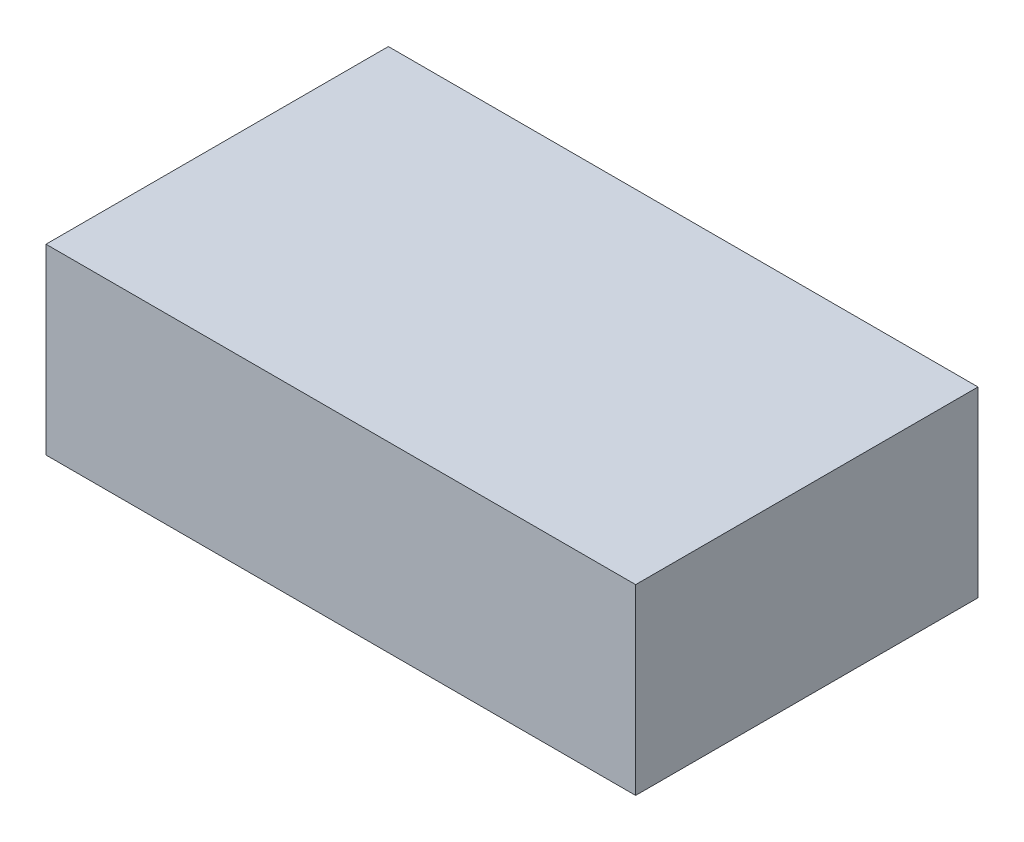
ISO-10303-21;
HEADER;
FILE_DESCRIPTION(('STEP AP214'),'2;1');
FILE_NAME('part.step','',(''),(''),'','','');
FILE_SCHEMA(('AUTOMOTIVE_DESIGN { 1 0 10303 214 1 1 1 1 }'));
ENDSEC;
DATA;
#1=APPLICATION_CONTEXT('core data for automotive mechanical design processes');
#2=APPLICATION_PROTOCOL_DEFINITION('international standard','automotive_design',2000,#1);
#3=PRODUCT_CONTEXT('',#1,'mechanical');
#4=PRODUCT('Part','Part','',(#3));
#5=PRODUCT_RELATED_PRODUCT_CATEGORY('part','',(#4));
#6=PRODUCT_DEFINITION_FORMATION('','',#4);
#7=PRODUCT_DEFINITION_CONTEXT('part definition',#1,'design');
#8=PRODUCT_DEFINITION('design','',#6,#7);
#9=PRODUCT_DEFINITION_SHAPE('','',#8);
#10=(LENGTH_UNIT() NAMED_UNIT(*) SI_UNIT(.MILLI.,.METRE.));
#11=(NAMED_UNIT(*) PLANE_ANGLE_UNIT() SI_UNIT($,.RADIAN.));
#12=(NAMED_UNIT(*) SI_UNIT($,.STERADIAN.) SOLID_ANGLE_UNIT());
#13=UNCERTAINTY_MEASURE_WITH_UNIT(LENGTH_MEASURE(1.E-05),#10,'distance_accuracy_value','');
#14=(GEOMETRIC_REPRESENTATION_CONTEXT(3) GLOBAL_UNCERTAINTY_ASSIGNED_CONTEXT((#13)) GLOBAL_UNIT_ASSIGNED_CONTEXT((#10,
#11,#12)) REPRESENTATION_CONTEXT('',''));
#15=CARTESIAN_POINT('',(0.,0.,0.));
#16=DIRECTION('',(0.,0.,1.));
#17=DIRECTION('',(1.,0.,0.));
#18=AXIS2_PLACEMENT_3D('',#15,#16,#17);
#19=CARTESIAN_POINT('',(0.,14.4,0.));
#20=DIRECTION('',(1.,0.,0.));
#21=DIRECTION('',(0.,0.,-1.));
#22=AXIS2_PLACEMENT_3D('',#19,#20,#21);
#23=PLANE('',#22);
#24=DIRECTION('',(0.,0.,1.));
#25=VECTOR('',#24,1.);
#26=CARTESIAN_POINT('',(0.,0.,0.));
#27=LINE('',#26,#25);
#28=CARTESIAN_POINT('',(0.,0.,-27.));
#29=VERTEX_POINT('',#28);
#30=CARTESIAN_POINT('',(0.,0.,0.));
#31=VERTEX_POINT('',#30);
#32=EDGE_CURVE('E100',#29,#31,#27,.T.);
#33=ORIENTED_EDGE('',*,*,#32,.T.);
#34=DIRECTION('',(0.,-1.,0.));
#35=VECTOR('',#34,1.);
#36=CARTESIAN_POINT('',(0.,14.4,0.));
#37=LINE('',#36,#35);
#38=CARTESIAN_POINT('',(0.,14.4,0.));
#39=VERTEX_POINT('',#38);
#40=EDGE_CURVE('E11',#39,#31,#37,.T.);
#41=ORIENTED_EDGE('',*,*,#40,.F.);
#42=DIRECTION('',(0.,0.,1.));
#43=VECTOR('',#42,1.);
#44=CARTESIAN_POINT('',(0.,14.4,0.));
#45=LINE('',#44,#43);
#46=CARTESIAN_POINT('',(0.,14.4,-27.));
#47=VERTEX_POINT('',#46);
#48=EDGE_CURVE('E88',#47,#39,#45,.T.);
#49=ORIENTED_EDGE('',*,*,#48,.F.);
#50=DIRECTION('',(0.,-1.,0.));
#51=VECTOR('',#50,1.);
#52=CARTESIAN_POINT('',(0.,14.4,-27.));
#53=LINE('',#52,#51);
#54=EDGE_CURVE('E96',#47,#29,#53,.T.);
#55=ORIENTED_EDGE('',*,*,#54,.T.);
#56=EDGE_LOOP('',(#33,#41,#49,#55));
#57=FACE_BOUND('',#56,.T.);
#58=ADVANCED_FACE('F37',(#57),#23,.F.);
#59=CARTESIAN_POINT('',(0.,14.4,0.));
#60=DIRECTION('',(0.,0.,-1.));
#61=DIRECTION('',(-1.,0.,0.));
#62=AXIS2_PLACEMENT_3D('',#59,#60,#61);
#63=PLANE('',#62);
#64=DIRECTION('',(1.,0.,0.));
#65=VECTOR('',#64,1.);
#66=CARTESIAN_POINT('',(0.,0.,0.));
#67=LINE('',#66,#65);
#68=CARTESIAN_POINT('',(46.5,0.,0.));
#69=VERTEX_POINT('',#68);
#70=EDGE_CURVE('E92',#31,#69,#67,.T.);
#71=ORIENTED_EDGE('',*,*,#70,.T.);
#72=DIRECTION('',(0.,-1.,0.));
#73=VECTOR('',#72,1.);
#74=CARTESIAN_POINT('',(46.5,14.4,0.));
#75=LINE('',#74,#73);
#76=CARTESIAN_POINT('',(46.5,14.4,0.));
#77=VERTEX_POINT('',#76);
#78=EDGE_CURVE('E45',#77,#69,#75,.T.);
#79=ORIENTED_EDGE('',*,*,#78,.F.);
#80=DIRECTION('',(1.,0.,0.));
#81=VECTOR('',#80,1.);
#82=CARTESIAN_POINT('',(0.,14.4,0.));
#83=LINE('',#82,#81);
#84=EDGE_CURVE('E83',#39,#77,#83,.T.);
#85=ORIENTED_EDGE('',*,*,#84,.F.);
#86=ORIENTED_EDGE('',*,*,#40,.T.);
#87=EDGE_LOOP('',(#71,#79,#85,#86));
#88=FACE_BOUND('',#87,.T.);
#89=ADVANCED_FACE('F91',(#88),#63,.F.);
#90=CARTESIAN_POINT('',(46.5,14.4,0.));
#91=DIRECTION('',(-1.,0.,0.));
#92=DIRECTION('',(0.,0.,1.));
#93=AXIS2_PLACEMENT_3D('',#90,#91,#92);
#94=PLANE('',#93);
#95=DIRECTION('',(0.,0.,-1.));
#96=VECTOR('',#95,1.);
#97=CARTESIAN_POINT('',(46.5,0.,0.));
#98=LINE('',#97,#96);
#99=CARTESIAN_POINT('',(46.5,0.,-27.));
#100=VERTEX_POINT('',#99);
#101=EDGE_CURVE('E70',#69,#100,#98,.T.);
#102=ORIENTED_EDGE('',*,*,#101,.T.);
#103=DIRECTION('',(0.,-1.,0.));
#104=VECTOR('',#103,1.);
#105=CARTESIAN_POINT('',(46.5,14.4,-27.));
#106=LINE('',#105,#104);
#107=CARTESIAN_POINT('',(46.5,14.4,-27.));
#108=VERTEX_POINT('',#107);
#109=EDGE_CURVE('E93',#108,#100,#106,.T.);
#110=ORIENTED_EDGE('',*,*,#109,.F.);
#111=DIRECTION('',(0.,0.,-1.));
#112=VECTOR('',#111,1.);
#113=CARTESIAN_POINT('',(46.5,14.4,0.));
#114=LINE('',#113,#112);
#115=EDGE_CURVE('E86',#77,#108,#114,.T.);
#116=ORIENTED_EDGE('',*,*,#115,.F.);
#117=ORIENTED_EDGE('',*,*,#78,.T.);
#118=EDGE_LOOP('',(#102,#110,#116,#117));
#119=FACE_BOUND('',#118,.T.);
#120=ADVANCED_FACE('F94',(#119),#94,.F.);
#121=CARTESIAN_POINT('',(0.,14.4,-27.));
#122=DIRECTION('',(0.,0.,1.));
#123=DIRECTION('',(1.,0.,0.));
#124=AXIS2_PLACEMENT_3D('',#121,#122,#123);
#125=PLANE('',#124);
#126=DIRECTION('',(-1.,0.,0.));
#127=VECTOR('',#126,1.);
#128=CARTESIAN_POINT('',(0.,0.,-27.));
#129=LINE('',#128,#127);
#130=EDGE_CURVE('E76',#100,#29,#129,.T.);
#131=ORIENTED_EDGE('',*,*,#130,.T.);
#132=ORIENTED_EDGE('',*,*,#54,.F.);
#133=DIRECTION('',(-1.,0.,0.));
#134=VECTOR('',#133,1.);
#135=CARTESIAN_POINT('',(0.,14.4,-27.));
#136=LINE('',#135,#134);
#137=EDGE_CURVE('E53',#108,#47,#136,.T.);
#138=ORIENTED_EDGE('',*,*,#137,.F.);
#139=ORIENTED_EDGE('',*,*,#109,.T.);
#140=EDGE_LOOP('',(#131,#132,#138,#139));
#141=FACE_BOUND('',#140,.T.);
#142=ADVANCED_FACE('F107',(#141),#125,.F.);
#143=CARTESIAN_POINT('',(0.,14.4,0.));
#144=DIRECTION('',(0.,-1.,0.));
#145=DIRECTION('',(0.,0.,-1.));
#146=AXIS2_PLACEMENT_3D('',#143,#144,#145);
#147=PLANE('',#146);
#148=ORIENTED_EDGE('',*,*,#48,.T.);
#149=ORIENTED_EDGE('',*,*,#84,.T.);
#150=ORIENTED_EDGE('',*,*,#115,.T.);
#151=ORIENTED_EDGE('',*,*,#137,.T.);
#152=EDGE_LOOP('',(#148,#149,#150,#151));
#153=FACE_BOUND('',#152,.T.);
#154=ADVANCED_FACE('F84',(#153),#147,.F.);
#155=CARTESIAN_POINT('',(0.,0.,0.));
#156=DIRECTION('',(0.,-1.,0.));
#157=DIRECTION('',(0.,0.,-1.));
#158=AXIS2_PLACEMENT_3D('',#155,#156,#157);
#159=PLANE('',#158);
#160=ORIENTED_EDGE('',*,*,#32,.F.);
#161=ORIENTED_EDGE('',*,*,#130,.F.);
#162=ORIENTED_EDGE('',*,*,#101,.F.);
#163=ORIENTED_EDGE('',*,*,#70,.F.);
#164=EDGE_LOOP('',(#160,#161,#162,#163));
#165=FACE_BOUND('',#164,.T.);
#166=ADVANCED_FACE('F110',(#165),#159,.T.);
#167=CLOSED_SHELL('',(#58,#89,#120,#142,#154,#166));
#168=MANIFOLD_SOLID_BREP('B2',#167);
#169=ADVANCED_BREP_SHAPE_REPRESENTATION('',(#18,#168),#14);
#170=SHAPE_DEFINITION_REPRESENTATION(#9,#169);
ENDSEC;
END-ISO-10303-21;
